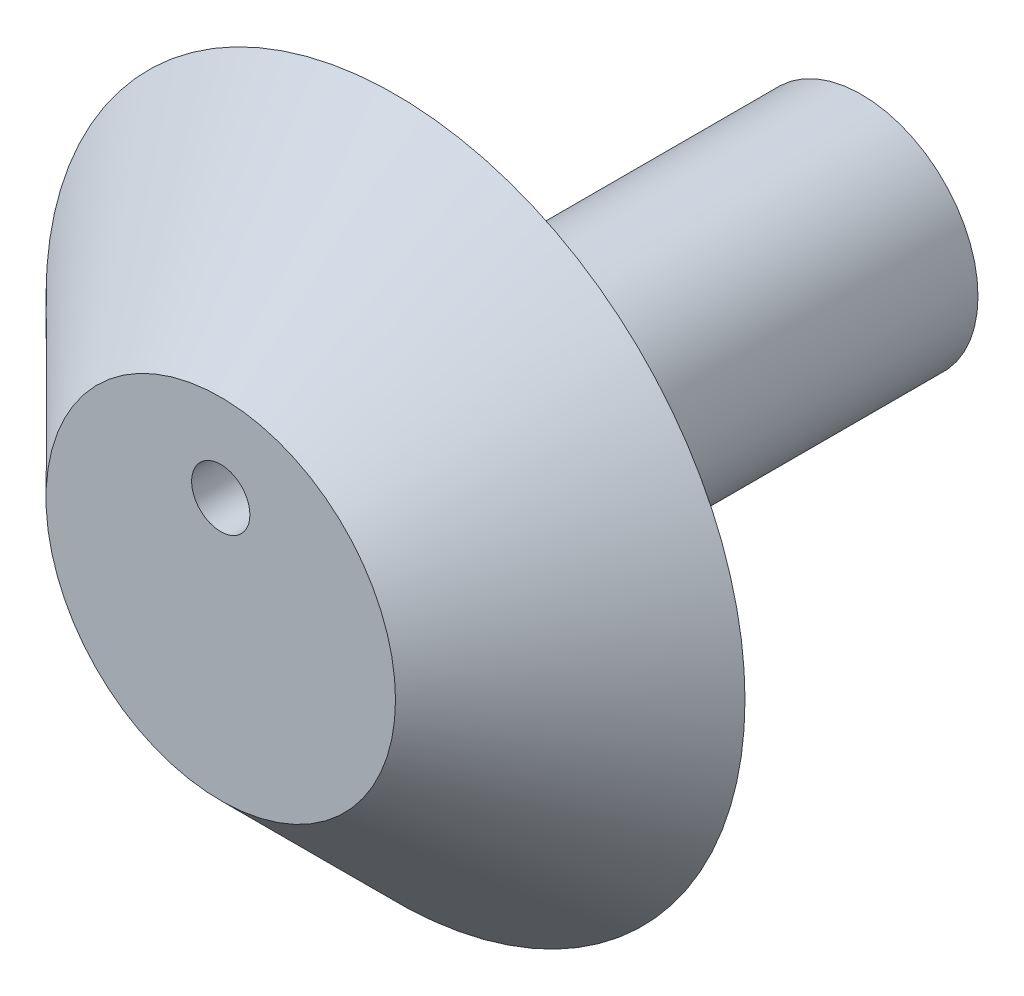
ISO-10303-21;
HEADER;
FILE_DESCRIPTION(('STEP AP214'),'2;1');
FILE_NAME('part.step','',(''),(''),'','','');
FILE_SCHEMA(('AUTOMOTIVE_DESIGN { 1 0 10303 214 1 1 1 1 }'));
ENDSEC;
DATA;
#1=APPLICATION_CONTEXT('core data for automotive mechanical design processes');
#2=APPLICATION_PROTOCOL_DEFINITION('international standard','automotive_design',2000,#1);
#3=PRODUCT_CONTEXT('',#1,'mechanical');
#4=PRODUCT('Part','Part','',(#3));
#5=PRODUCT_RELATED_PRODUCT_CATEGORY('part','',(#4));
#6=PRODUCT_DEFINITION_FORMATION('','',#4);
#7=PRODUCT_DEFINITION_CONTEXT('part definition',#1,'design');
#8=PRODUCT_DEFINITION('design','',#6,#7);
#9=PRODUCT_DEFINITION_SHAPE('','',#8);
#10=(LENGTH_UNIT() NAMED_UNIT(*) SI_UNIT(.MILLI.,.METRE.));
#11=(NAMED_UNIT(*) PLANE_ANGLE_UNIT() SI_UNIT($,.RADIAN.));
#12=(NAMED_UNIT(*) SI_UNIT($,.STERADIAN.) SOLID_ANGLE_UNIT());
#13=UNCERTAINTY_MEASURE_WITH_UNIT(LENGTH_MEASURE(1.E-05),#10,'distance_accuracy_value','');
#14=(GEOMETRIC_REPRESENTATION_CONTEXT(3) GLOBAL_UNCERTAINTY_ASSIGNED_CONTEXT((#13)) GLOBAL_UNIT_ASSIGNED_CONTEXT((#10,
#11,#12)) REPRESENTATION_CONTEXT('',''));
#15=CARTESIAN_POINT('',(0.,0.,0.));
#16=DIRECTION('',(0.,0.,1.));
#17=DIRECTION('',(1.,0.,0.));
#18=AXIS2_PLACEMENT_3D('',#15,#16,#17);
#19=CARTESIAN_POINT('',(-5.75000000000008,0.,-128.5));
#20=DIRECTION('',(0.,0.,1.));
#21=DIRECTION('',(1.,0.,0.));
#22=AXIS2_PLACEMENT_3D('',#19,#20,#21);
#23=PLANE('',#22);
#24=CARTESIAN_POINT('',(-5.75000000000008,0.,-128.5));
#25=DIRECTION('',(0.,0.,1.));
#26=DIRECTION('',(1.,0.,0.));
#27=AXIS2_PLACEMENT_3D('',#24,#25,#26);
#28=CIRCLE('',#27,1.);
#29=CARTESIAN_POINT('',(-4.75000000000008,0.,-128.5));
#30=VERTEX_POINT('',#29);
#31=EDGE_CURVE('E44',#30,#30,#28,.T.);
#32=ORIENTED_EDGE('',*,*,#31,.T.);
#33=EDGE_LOOP('',(#32));
#34=FACE_BOUND('',#33,.T.);
#35=CARTESIAN_POINT('',(-5.75000000000008,0.,-128.5));
#36=DIRECTION('',(0.,0.,1.));
#37=DIRECTION('',(1.,0.,0.));
#38=AXIS2_PLACEMENT_3D('',#35,#36,#37);
#39=CIRCLE('',#38,3.);
#40=CARTESIAN_POINT('',(-2.75000000000008,0.,-128.5));
#41=VERTEX_POINT('',#40);
#42=EDGE_CURVE('E53',#41,#41,#39,.T.);
#43=ORIENTED_EDGE('',*,*,#42,.F.);
#44=EDGE_LOOP('',(#43));
#45=FACE_BOUND('',#44,.T.);
#46=ADVANCED_FACE('F37',(#34,#45),#23,.F.);
#47=CARTESIAN_POINT('',(-5.75000000000008,0.,-132.5));
#48=DIRECTION('',(0.,0.,1.));
#49=DIRECTION('',(1.,0.,0.));
#50=AXIS2_PLACEMENT_3D('',#47,#48,#49);
#51=CYLINDRICAL_SURFACE('',#50,1.);
#52=CARTESIAN_POINT('',(-5.75000000000008,0.,-132.5));
#53=DIRECTION('',(0.,0.,1.));
#54=DIRECTION('',(1.,0.,0.));
#55=AXIS2_PLACEMENT_3D('',#52,#53,#54);
#56=CIRCLE('',#55,1.);
#57=CARTESIAN_POINT('',(-4.75000000000008,0.,-132.5));
#58=VERTEX_POINT('',#57);
#59=EDGE_CURVE('E10',#58,#58,#56,.T.);
#60=ORIENTED_EDGE('',*,*,#59,.T.);
#61=EDGE_LOOP('',(#60));
#62=FACE_BOUND('',#61,.T.);
#63=ORIENTED_EDGE('',*,*,#31,.F.);
#64=EDGE_LOOP('',(#63));
#65=FACE_BOUND('',#64,.T.);
#66=ADVANCED_FACE('F79',(#62,#65),#51,.T.);
#67=CARTESIAN_POINT('',(-5.75000000000008,0.,-132.5));
#68=DIRECTION('',(0.,0.,1.));
#69=DIRECTION('',(1.,0.,0.));
#70=AXIS2_PLACEMENT_3D('',#67,#68,#69);
#71=PLANE('',#70);
#72=ORIENTED_EDGE('',*,*,#59,.F.);
#73=EDGE_LOOP('',(#72));
#74=FACE_BOUND('',#73,.T.);
#75=ADVANCED_FACE('F85',(#74),#71,.F.);
#76=CARTESIAN_POINT('',(-5.75000000000008,0.,-127.));
#77=DIRECTION('',(0.,0.,-1.));
#78=DIRECTION('',(-1.,0.,0.));
#79=AXIS2_PLACEMENT_3D('',#76,#77,#78);
#80=CONICAL_SURFACE('',#79,1.50000000000001,0.785398163397443);
#81=ORIENTED_EDGE('',*,*,#42,.T.);
#82=EDGE_LOOP('',(#81));
#83=FACE_BOUND('',#82,.T.);
#84=CARTESIAN_POINT('',(-5.75000000000008,0.,-127.));
#85=DIRECTION('',(0.,0.,1.));
#86=DIRECTION('',(1.,0.,0.));
#87=AXIS2_PLACEMENT_3D('',#84,#85,#86);
#88=CIRCLE('',#87,1.50000000000001);
#89=CARTESIAN_POINT('',(-4.25000000000007,0.,-127.));
#90=VERTEX_POINT('',#89);
#91=EDGE_CURVE('E49',#90,#90,#88,.T.);
#92=ORIENTED_EDGE('',*,*,#91,.F.);
#93=EDGE_LOOP('',(#92));
#94=FACE_BOUND('',#93,.T.);
#95=ADVANCED_FACE('F76',(#83,#94),#80,.T.);
#96=CARTESIAN_POINT('',(-5.75000000000008,0.,-127.));
#97=DIRECTION('',(0.,0.,1.));
#98=DIRECTION('',(1.,0.,0.));
#99=AXIS2_PLACEMENT_3D('',#96,#97,#98);
#100=PLANE('',#99);
#101=CARTESIAN_POINT('',(-5.75000000000008,0.750000000000006,-127.));
#102=DIRECTION('',(0.,0.,1.));
#103=DIRECTION('',(1.,0.,0.));
#104=AXIS2_PLACEMENT_3D('',#101,#102,#103);
#105=CIRCLE('',#104,0.25);
#106=CARTESIAN_POINT('',(-5.50000000000008,0.750000000000006,-127.));
#107=VERTEX_POINT('',#106);
#108=EDGE_CURVE('E40',#107,#107,#105,.F.);
#109=ORIENTED_EDGE('',*,*,#108,.T.);
#110=EDGE_LOOP('',(#109));
#111=FACE_BOUND('',#110,.T.);
#112=ORIENTED_EDGE('',*,*,#91,.T.);
#113=EDGE_LOOP('',(#112));
#114=FACE_BOUND('',#113,.T.);
#115=ADVANCED_FACE('F63',(#111,#114),#100,.T.);
#116=CARTESIAN_POINT('',(-5.75000000000008,0.750000000000006,-126.999988));
#117=DIRECTION('',(0.,0.,-1.));
#118=DIRECTION('',(-1.,0.,0.));
#119=AXIS2_PLACEMENT_3D('',#116,#117,#118);
#120=CYLINDRICAL_SURFACE('',#119,0.25);
#121=ORIENTED_EDGE('',*,*,#108,.F.);
#122=EDGE_LOOP('',(#121));
#123=FACE_BOUND('',#122,.T.);
#124=CARTESIAN_POINT('',(-5.75000000000008,0.750000000000006,-128.));
#125=DIRECTION('',(0.,0.,1.));
#126=DIRECTION('',(1.,0.,0.));
#127=AXIS2_PLACEMENT_3D('',#124,#125,#126);
#128=CIRCLE('',#127,0.25);
#129=CARTESIAN_POINT('',(-5.50000000000008,0.750000000000006,-128.));
#130=VERTEX_POINT('',#129);
#131=EDGE_CURVE('E56',#130,#130,#128,.T.);
#132=ORIENTED_EDGE('',*,*,#131,.F.);
#133=EDGE_LOOP('',(#132));
#134=FACE_BOUND('',#133,.T.);
#135=ADVANCED_FACE('F66',(#123,#134),#120,.F.);
#136=CARTESIAN_POINT('',(-5.75000000000008,0.750000000000006,-128.));
#137=DIRECTION('',(0.,0.,1.));
#138=DIRECTION('',(1.,0.,0.));
#139=AXIS2_PLACEMENT_3D('',#136,#137,#138);
#140=PLANE('',#139);
#141=ORIENTED_EDGE('',*,*,#131,.T.);
#142=EDGE_LOOP('',(#141));
#143=FACE_BOUND('',#142,.T.);
#144=ADVANCED_FACE('F69',(#143),#140,.T.);
#145=CLOSED_SHELL('',(#46,#66,#75,#95,#115,#135,#144));
#146=MANIFOLD_SOLID_BREP('B2',#145);
#147=ADVANCED_BREP_SHAPE_REPRESENTATION('',(#18,#146),#14);
#148=SHAPE_DEFINITION_REPRESENTATION(#9,#147);
ENDSEC;
END-ISO-10303-21;
